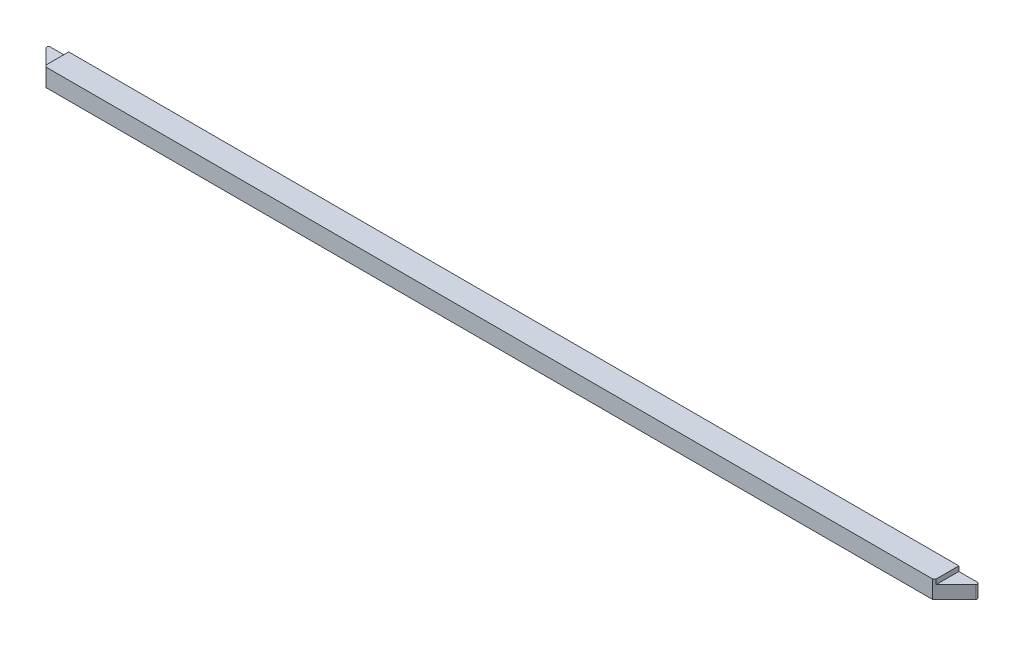
ISO-10303-21;
HEADER;
FILE_DESCRIPTION(('STEP AP214'),'2;1');
FILE_NAME('part.step','',(''),(''),'','','');
FILE_SCHEMA(('AUTOMOTIVE_DESIGN { 1 0 10303 214 1 1 1 1 }'));
ENDSEC;
DATA;
#1=APPLICATION_CONTEXT('core data for automotive mechanical design processes');
#2=APPLICATION_PROTOCOL_DEFINITION('international standard','automotive_design',2000,#1);
#3=PRODUCT_CONTEXT('',#1,'mechanical');
#4=PRODUCT('Part','Part','',(#3));
#5=PRODUCT_RELATED_PRODUCT_CATEGORY('part','',(#4));
#6=PRODUCT_DEFINITION_FORMATION('','',#4);
#7=PRODUCT_DEFINITION_CONTEXT('part definition',#1,'design');
#8=PRODUCT_DEFINITION('design','',#6,#7);
#9=PRODUCT_DEFINITION_SHAPE('','',#8);
#10=(LENGTH_UNIT() NAMED_UNIT(*) SI_UNIT(.MILLI.,.METRE.));
#11=(NAMED_UNIT(*) PLANE_ANGLE_UNIT() SI_UNIT($,.RADIAN.));
#12=(NAMED_UNIT(*) SI_UNIT($,.STERADIAN.) SOLID_ANGLE_UNIT());
#13=UNCERTAINTY_MEASURE_WITH_UNIT(LENGTH_MEASURE(1.E-05),#10,'distance_accuracy_value','');
#14=(GEOMETRIC_REPRESENTATION_CONTEXT(3) GLOBAL_UNCERTAINTY_ASSIGNED_CONTEXT((#13)) GLOBAL_UNIT_ASSIGNED_CONTEXT((#10,
#11,#12)) REPRESENTATION_CONTEXT('',''));
#15=CARTESIAN_POINT('',(0.,0.,0.));
#16=DIRECTION('',(0.,0.,1.));
#17=DIRECTION('',(1.,0.,0.));
#18=AXIS2_PLACEMENT_3D('',#15,#16,#17);
#19=CARTESIAN_POINT('',(200.,4.,0.));
#20=DIRECTION('',(-1.,0.,0.));
#21=DIRECTION('',(0.,0.,1.));
#22=AXIS2_PLACEMENT_3D('',#19,#20,#21);
#23=PLANE('',#22);
#24=DIRECTION('',(0.,0.,1.));
#25=VECTOR('',#24,1.);
#26=CARTESIAN_POINT('',(200.,2.9,-0.400000000000039));
#27=LINE('',#26,#25);
#28=CARTESIAN_POINT('',(200.,2.9,-5.5));
#29=VERTEX_POINT('',#28);
#30=CARTESIAN_POINT('',(200.,2.9,-0.400000000000039));
#31=VERTEX_POINT('',#30);
#32=EDGE_CURVE('E120',#29,#31,#27,.T.);
#33=ORIENTED_EDGE('',*,*,#32,.F.);
#34=DIRECTION('',(0.,-1.,0.));
#35=VECTOR('',#34,1.);
#36=CARTESIAN_POINT('',(200.,4.,-5.5));
#37=LINE('',#36,#35);
#38=CARTESIAN_POINT('',(200.,4.,-5.5));
#39=VERTEX_POINT('',#38);
#40=EDGE_CURVE('E125',#39,#29,#37,.T.);
#41=ORIENTED_EDGE('',*,*,#40,.F.);
#42=DIRECTION('',(0.,0.,-1.));
#43=VECTOR('',#42,1.);
#44=CARTESIAN_POINT('',(200.,4.,0.));
#45=LINE('',#44,#43);
#46=CARTESIAN_POINT('',(200.,4.,-0.400000000000011));
#47=VERTEX_POINT('',#46);
#48=EDGE_CURVE('E122',#47,#39,#45,.T.);
#49=ORIENTED_EDGE('',*,*,#48,.F.);
#50=DIRECTION('',(0.,-1.,0.));
#51=VECTOR('',#50,1.);
#52=CARTESIAN_POINT('',(200.,4.,-0.400000000000011));
#53=LINE('',#52,#51);
#54=EDGE_CURVE('E117',#47,#31,#53,.T.);
#55=ORIENTED_EDGE('',*,*,#54,.T.);
#56=EDGE_LOOP('',(#33,#41,#49,#55));
#57=FACE_BOUND('',#56,.T.);
#58=ADVANCED_FACE('F38',(#57),#23,.F.);
#59=CARTESIAN_POINT('',(0.,4.,0.));
#60=DIRECTION('',(1.,0.,0.));
#61=DIRECTION('',(0.,0.,-1.));
#62=AXIS2_PLACEMENT_3D('',#59,#60,#61);
#63=PLANE('',#62);
#64=DIRECTION('',(0.,-1.,0.));
#65=VECTOR('',#64,1.);
#66=CARTESIAN_POINT('',(0.,4.,-5.5));
#67=LINE('',#66,#65);
#68=CARTESIAN_POINT('',(0.,4.,-5.5));
#69=VERTEX_POINT('',#68);
#70=CARTESIAN_POINT('',(0.,2.9,-5.5));
#71=VERTEX_POINT('',#70);
#72=EDGE_CURVE('E156',#69,#71,#67,.T.);
#73=ORIENTED_EDGE('',*,*,#72,.T.);
#74=DIRECTION('',(0.,0.,1.));
#75=VECTOR('',#74,1.);
#76=CARTESIAN_POINT('',(0.,2.9,-0.400000000000039));
#77=LINE('',#76,#75);
#78=CARTESIAN_POINT('',(0.,2.9,-0.400000000000012));
#79=VERTEX_POINT('',#78);
#80=EDGE_CURVE('E141',#71,#79,#77,.T.);
#81=ORIENTED_EDGE('',*,*,#80,.T.);
#82=DIRECTION('',(0.,1.,0.));
#83=VECTOR('',#82,1.);
#84=CARTESIAN_POINT('',(0.,4.,-0.400000000000012));
#85=LINE('',#84,#83);
#86=CARTESIAN_POINT('',(0.,4.,-0.400000000000012));
#87=VERTEX_POINT('',#86);
#88=EDGE_CURVE('E177',#79,#87,#85,.T.);
#89=ORIENTED_EDGE('',*,*,#88,.T.);
#90=DIRECTION('',(0.,0.,1.));
#91=VECTOR('',#90,1.);
#92=CARTESIAN_POINT('',(0.,4.,0.));
#93=LINE('',#92,#91);
#94=EDGE_CURVE('E146',#69,#87,#93,.T.);
#95=ORIENTED_EDGE('',*,*,#94,.F.);
#96=EDGE_LOOP('',(#73,#81,#89,#95));
#97=FACE_BOUND('',#96,.T.);
#98=ADVANCED_FACE('F210',(#97),#63,.F.);
#99=CARTESIAN_POINT('',(0.,4.,0.));
#100=DIRECTION('',(0.,0.,-1.));
#101=DIRECTION('',(-1.,0.,0.));
#102=AXIS2_PLACEMENT_3D('',#99,#100,#101);
#103=PLANE('',#102);
#104=DIRECTION('',(1.,0.,0.));
#105=VECTOR('',#104,1.);
#106=CARTESIAN_POINT('',(0.,0.,0.));
#107=LINE('',#106,#105);
#108=CARTESIAN_POINT('',(0.400000000000011,0.,0.));
#109=VERTEX_POINT('',#108);
#110=CARTESIAN_POINT('',(199.6,0.,0.));
#111=VERTEX_POINT('',#110);
#112=EDGE_CURVE('E144',#109,#111,#107,.T.);
#113=ORIENTED_EDGE('',*,*,#112,.T.);
#114=DIRECTION('',(0.,1.,0.));
#115=VECTOR('',#114,1.);
#116=CARTESIAN_POINT('',(199.6,4.,0.));
#117=LINE('',#116,#115);
#118=CARTESIAN_POINT('',(199.6,4.,0.));
#119=VERTEX_POINT('',#118);
#120=EDGE_CURVE('E171',#111,#119,#117,.T.);
#121=ORIENTED_EDGE('',*,*,#120,.T.);
#122=DIRECTION('',(1.,0.,0.));
#123=VECTOR('',#122,1.);
#124=CARTESIAN_POINT('',(0.,4.,0.));
#125=LINE('',#124,#123);
#126=CARTESIAN_POINT('',(0.400000000000011,4.,0.));
#127=VERTEX_POINT('',#126);
#128=EDGE_CURVE('E149',#127,#119,#125,.T.);
#129=ORIENTED_EDGE('',*,*,#128,.F.);
#130=DIRECTION('',(0.,-1.,0.));
#131=VECTOR('',#130,1.);
#132=CARTESIAN_POINT('',(0.400000000000011,4.,0.));
#133=LINE('',#132,#131);
#134=EDGE_CURVE('E168',#127,#109,#133,.T.);
#135=ORIENTED_EDGE('',*,*,#134,.T.);
#136=EDGE_LOOP('',(#113,#121,#129,#135));
#137=FACE_BOUND('',#136,.T.);
#138=ADVANCED_FACE('F203',(#137),#103,.F.);
#139=CARTESIAN_POINT('',(0.,4.,-5.5));
#140=DIRECTION('',(0.,0.,1.));
#141=DIRECTION('',(1.,0.,0.));
#142=AXIS2_PLACEMENT_3D('',#139,#140,#141);
#143=PLANE('',#142);
#144=DIRECTION('',(-1.,0.,0.));
#145=VECTOR('',#144,1.);
#146=CARTESIAN_POINT('',(200.,2.9,-5.5));
#147=LINE('',#146,#145);
#148=CARTESIAN_POINT('',(204.134314575051,2.9,-5.5));
#149=VERTEX_POINT('',#148);
#150=EDGE_CURVE('E132',#149,#29,#147,.T.);
#151=ORIENTED_EDGE('',*,*,#150,.F.);
#152=DIRECTION('',(0.,1.,0.));
#153=VECTOR('',#152,1.);
#154=CARTESIAN_POINT('',(204.134314575051,0.,-5.5));
#155=LINE('',#154,#153);
#156=CARTESIAN_POINT('',(204.134314575051,0.,-5.5));
#157=VERTEX_POINT('',#156);
#158=EDGE_CURVE('E181',#149,#157,#155,.F.);
#159=ORIENTED_EDGE('',*,*,#158,.T.);
#160=DIRECTION('',(-1.,0.,0.));
#161=VECTOR('',#160,1.);
#162=CARTESIAN_POINT('',(0.,0.,-5.5));
#163=LINE('',#162,#161);
#164=CARTESIAN_POINT('',(-4.13431457505075,0.,-5.5));
#165=VERTEX_POINT('',#164);
#166=EDGE_CURVE('E150',#157,#165,#163,.T.);
#167=ORIENTED_EDGE('',*,*,#166,.T.);
#168=DIRECTION('',(0.,1.,0.));
#169=VECTOR('',#168,1.);
#170=CARTESIAN_POINT('',(-4.13431457505075,2.9,-5.5));
#171=LINE('',#170,#169);
#172=CARTESIAN_POINT('',(-4.13431457505075,2.9,-5.5));
#173=VERTEX_POINT('',#172);
#174=EDGE_CURVE('E179',#165,#173,#171,.T.);
#175=ORIENTED_EDGE('',*,*,#174,.T.);
#176=DIRECTION('',(1.,0.,0.));
#177=VECTOR('',#176,1.);
#178=CARTESIAN_POINT('',(0.,2.9,-5.5));
#179=LINE('',#178,#177);
#180=EDGE_CURVE('E139',#173,#71,#179,.T.);
#181=ORIENTED_EDGE('',*,*,#180,.T.);
#182=ORIENTED_EDGE('',*,*,#72,.F.);
#183=DIRECTION('',(-1.,0.,0.));
#184=VECTOR('',#183,1.);
#185=CARTESIAN_POINT('',(0.,4.,-5.5));
#186=LINE('',#185,#184);
#187=EDGE_CURVE('E154',#39,#69,#186,.T.);
#188=ORIENTED_EDGE('',*,*,#187,.F.);
#189=ORIENTED_EDGE('',*,*,#40,.T.);
#190=EDGE_LOOP('',(#151,#159,#167,#175,#181,#182,#188,#189));
#191=FACE_BOUND('',#190,.T.);
#192=ADVANCED_FACE('F215',(#191),#143,.F.);
#193=CARTESIAN_POINT('',(0.,4.,0.));
#194=DIRECTION('',(0.,-1.,0.));
#195=DIRECTION('',(0.,0.,-1.));
#196=AXIS2_PLACEMENT_3D('',#193,#194,#195);
#197=PLANE('',#196);
#198=ORIENTED_EDGE('',*,*,#128,.T.);
#199=DIRECTION('',(-0.707106781186548,0.,0.707106781186548));
#200=VECTOR('',#199,1.);
#201=CARTESIAN_POINT('',(200.,4.,-0.400000000000011));
#202=LINE('',#201,#200);
#203=EDGE_CURVE('E175',#119,#47,#202,.F.);
#204=ORIENTED_EDGE('',*,*,#203,.T.);
#205=ORIENTED_EDGE('',*,*,#48,.T.);
#206=ORIENTED_EDGE('',*,*,#187,.T.);
#207=ORIENTED_EDGE('',*,*,#94,.T.);
#208=DIRECTION('',(-0.707106781186548,0.,-0.707106781186548));
#209=VECTOR('',#208,1.);
#210=CARTESIAN_POINT('',(0.400000000000011,4.,0.));
#211=LINE('',#210,#209);
#212=EDGE_CURVE('E173',#87,#127,#211,.F.);
#213=ORIENTED_EDGE('',*,*,#212,.T.);
#214=EDGE_LOOP('',(#198,#204,#205,#206,#207,#213));
#215=FACE_BOUND('',#214,.T.);
#216=ADVANCED_FACE('F206',(#215),#197,.F.);
#217=CARTESIAN_POINT('',(0.,0.,0.));
#218=DIRECTION('',(0.,-1.,0.));
#219=DIRECTION('',(0.,0.,-1.));
#220=AXIS2_PLACEMENT_3D('',#217,#218,#219);
#221=PLANE('',#220);
#222=ORIENTED_EDGE('',*,*,#166,.F.);
#223=CARTESIAN_POINT('',(204.134314575051,0.,-5.1));
#224=DIRECTION('',(0.,-1.,0.));
#225=DIRECTION('',(0.,0.,-1.));
#226=AXIS2_PLACEMENT_3D('',#223,#224,#225);
#227=CIRCLE('',#226,0.4);
#228=CARTESIAN_POINT('',(204.417157287525,0.,-4.81715728752541));
#229=VERTEX_POINT('',#228);
#230=EDGE_CURVE('E186',#157,#229,#227,.T.);
#231=ORIENTED_EDGE('',*,*,#230,.T.);
#232=DIRECTION('',(0.707106781186548,0.,-0.707106781186548));
#233=VECTOR('',#232,1.);
#234=CARTESIAN_POINT('',(99.8,0.,99.8));
#235=LINE('',#234,#233);
#236=EDGE_CURVE('E166',#229,#111,#235,.F.);
#237=ORIENTED_EDGE('',*,*,#236,.T.);
#238=ORIENTED_EDGE('',*,*,#112,.F.);
#239=DIRECTION('',(0.707106781186548,0.,0.707106781186548));
#240=VECTOR('',#239,1.);
#241=CARTESIAN_POINT('',(0.200000000000006,0.,-0.200000000000006));
#242=LINE('',#241,#240);
#243=CARTESIAN_POINT('',(-4.41715728752537,0.,-4.81715728752538));
#244=VERTEX_POINT('',#243);
#245=EDGE_CURVE('E124',#109,#244,#242,.F.);
#246=ORIENTED_EDGE('',*,*,#245,.T.);
#247=CARTESIAN_POINT('',(-4.13431457505075,0.,-5.1));
#248=DIRECTION('',(0.,-1.,0.));
#249=DIRECTION('',(0.,0.,-1.));
#250=AXIS2_PLACEMENT_3D('',#247,#248,#249);
#251=CIRCLE('',#250,0.4);
#252=EDGE_CURVE('E184',#244,#165,#251,.T.);
#253=ORIENTED_EDGE('',*,*,#252,.T.);
#254=EDGE_LOOP('',(#222,#231,#237,#238,#246,#253));
#255=FACE_BOUND('',#254,.T.);
#256=ADVANCED_FACE('F200',(#255),#221,.T.);
#257=CARTESIAN_POINT('',(200.,4.,-0.400000000000011));
#258=DIRECTION('',(-0.707106781186548,0.,-0.707106781186548));
#259=DIRECTION('',(0.,-1.,0.));
#260=AXIS2_PLACEMENT_3D('',#257,#258,#259);
#261=PLANE('',#260);
#262=ORIENTED_EDGE('',*,*,#236,.F.);
#263=DIRECTION('',(0.,-1.,0.));
#264=VECTOR('',#263,1.);
#265=CARTESIAN_POINT('',(204.417157287525,2.9,-4.81715728752537));
#266=LINE('',#265,#264);
#267=CARTESIAN_POINT('',(204.417157287525,2.9,-4.81715728752538));
#268=VERTEX_POINT('',#267);
#269=EDGE_CURVE('E59',#229,#268,#266,.F.);
#270=ORIENTED_EDGE('',*,*,#269,.T.);
#271=DIRECTION('',(0.707106781186549,0.,-0.707106781186546));
#272=VECTOR('',#271,1.);
#273=CARTESIAN_POINT('',(205.1,2.9,-5.5));
#274=LINE('',#273,#272);
#275=EDGE_CURVE('E129',#31,#268,#274,.T.);
#276=ORIENTED_EDGE('',*,*,#275,.F.);
#277=ORIENTED_EDGE('',*,*,#54,.F.);
#278=ORIENTED_EDGE('',*,*,#203,.F.);
#279=ORIENTED_EDGE('',*,*,#120,.F.);
#280=EDGE_LOOP('',(#262,#270,#276,#277,#278,#279));
#281=FACE_BOUND('',#280,.T.);
#282=ADVANCED_FACE('F134',(#281),#261,.F.);
#283=CARTESIAN_POINT('',(0.400000000000011,4.,0.));
#284=DIRECTION('',(0.707106781186548,0.,-0.707106781186548));
#285=DIRECTION('',(0.,-1.,0.));
#286=AXIS2_PLACEMENT_3D('',#283,#284,#285);
#287=PLANE('',#286);
#288=DIRECTION('',(-0.70710678118655,0.,-0.707106781186546));
#289=VECTOR('',#288,1.);
#290=CARTESIAN_POINT('',(-5.09999999999999,2.9,-5.5));
#291=LINE('',#290,#289);
#292=CARTESIAN_POINT('',(-4.41715728752537,2.9,-4.81715728752538));
#293=VERTEX_POINT('',#292);
#294=EDGE_CURVE('E138',#79,#293,#291,.T.);
#295=ORIENTED_EDGE('',*,*,#294,.T.);
#296=DIRECTION('',(0.,-1.,0.));
#297=VECTOR('',#296,1.);
#298=CARTESIAN_POINT('',(-4.41715728752537,0.,-4.81715728752538));
#299=LINE('',#298,#297);
#300=EDGE_CURVE('E46',#293,#244,#299,.T.);
#301=ORIENTED_EDGE('',*,*,#300,.T.);
#302=ORIENTED_EDGE('',*,*,#245,.F.);
#303=ORIENTED_EDGE('',*,*,#134,.F.);
#304=ORIENTED_EDGE('',*,*,#212,.F.);
#305=ORIENTED_EDGE('',*,*,#88,.F.);
#306=EDGE_LOOP('',(#295,#301,#302,#303,#304,#305));
#307=FACE_BOUND('',#306,.T.);
#308=ADVANCED_FACE('F193',(#307),#287,.F.);
#309=CARTESIAN_POINT('',(0.,2.9,0.));
#310=DIRECTION('',(0.,-1.,0.));
#311=DIRECTION('',(0.,0.,-1.));
#312=AXIS2_PLACEMENT_3D('',#309,#310,#311);
#313=PLANE('',#312);
#314=ORIENTED_EDGE('',*,*,#180,.F.);
#315=CARTESIAN_POINT('',(-4.13431457505075,2.9,-5.1));
#316=DIRECTION('',(0.,-1.,0.));
#317=DIRECTION('',(0.,0.,-1.));
#318=AXIS2_PLACEMENT_3D('',#315,#316,#317);
#319=CIRCLE('',#318,0.4);
#320=EDGE_CURVE('E12',#173,#293,#319,.F.);
#321=ORIENTED_EDGE('',*,*,#320,.T.);
#322=ORIENTED_EDGE('',*,*,#294,.F.);
#323=ORIENTED_EDGE('',*,*,#80,.F.);
#324=EDGE_LOOP('',(#314,#321,#322,#323));
#325=FACE_BOUND('',#324,.T.);
#326=ADVANCED_FACE('F217',(#325),#313,.F.);
#327=CARTESIAN_POINT('',(0.,2.9,0.));
#328=DIRECTION('',(0.,-1.,0.));
#329=DIRECTION('',(0.,0.,-1.));
#330=AXIS2_PLACEMENT_3D('',#327,#328,#329);
#331=PLANE('',#330);
#332=ORIENTED_EDGE('',*,*,#275,.T.);
#333=CARTESIAN_POINT('',(204.134314575051,2.9,-5.1));
#334=DIRECTION('',(0.,-1.,0.));
#335=DIRECTION('',(0.,0.,-1.));
#336=AXIS2_PLACEMENT_3D('',#333,#334,#335);
#337=CIRCLE('',#336,0.4);
#338=EDGE_CURVE('E189',#268,#149,#337,.F.);
#339=ORIENTED_EDGE('',*,*,#338,.T.);
#340=ORIENTED_EDGE('',*,*,#150,.T.);
#341=ORIENTED_EDGE('',*,*,#32,.T.);
#342=EDGE_LOOP('',(#332,#339,#340,#341));
#343=FACE_BOUND('',#342,.T.);
#344=ADVANCED_FACE('F128',(#343),#331,.F.);
#345=CARTESIAN_POINT('',(204.134314575051,4.,-5.1));
#346=DIRECTION('',(0.,-1.,0.));
#347=DIRECTION('',(0.,0.,-1.));
#348=AXIS2_PLACEMENT_3D('',#345,#346,#347);
#349=CYLINDRICAL_SURFACE('',#348,0.4);
#350=ORIENTED_EDGE('',*,*,#338,.F.);
#351=ORIENTED_EDGE('',*,*,#269,.F.);
#352=ORIENTED_EDGE('',*,*,#230,.F.);
#353=ORIENTED_EDGE('',*,*,#158,.F.);
#354=EDGE_LOOP('',(#350,#351,#352,#353));
#355=FACE_BOUND('',#354,.T.);
#356=ADVANCED_FACE('F224',(#355),#349,.T.);
#357=CARTESIAN_POINT('',(-4.13431457505075,4.,-5.1));
#358=DIRECTION('',(0.,-1.,0.));
#359=DIRECTION('',(0.,0.,-1.));
#360=AXIS2_PLACEMENT_3D('',#357,#358,#359);
#361=CYLINDRICAL_SURFACE('',#360,0.4);
#362=ORIENTED_EDGE('',*,*,#320,.F.);
#363=ORIENTED_EDGE('',*,*,#174,.F.);
#364=ORIENTED_EDGE('',*,*,#252,.F.);
#365=ORIENTED_EDGE('',*,*,#300,.F.);
#366=EDGE_LOOP('',(#362,#363,#364,#365));
#367=FACE_BOUND('',#366,.T.);
#368=ADVANCED_FACE('F40',(#367),#361,.T.);
#369=CLOSED_SHELL('',(#58,#98,#138,#192,#216,#256,#282,#308,#326,#344,#356,#368));
#370=MANIFOLD_SOLID_BREP('B2',#369);
#371=ADVANCED_BREP_SHAPE_REPRESENTATION('',(#18,#370),#14);
#372=SHAPE_DEFINITION_REPRESENTATION(#9,#371);
ENDSEC;
END-ISO-10303-21;
